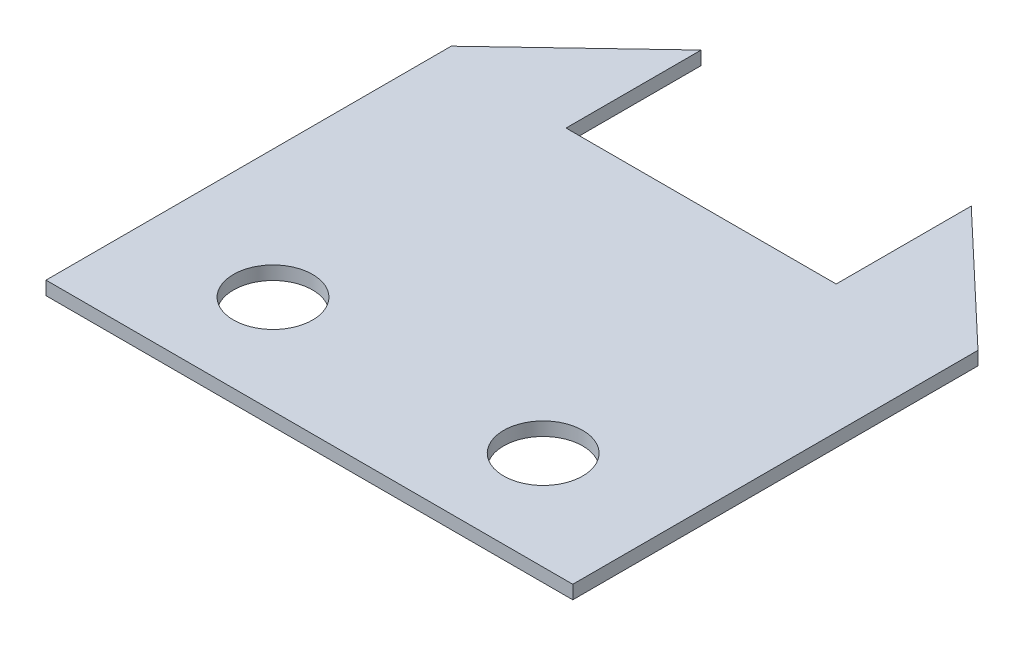
ISO-10303-21;
HEADER;
FILE_DESCRIPTION(('STEP AP214'),'2;1');
FILE_NAME('part.step','',(''),(''),'','','');
FILE_SCHEMA(('AUTOMOTIVE_DESIGN { 1 0 10303 214 1 1 1 1 }'));
ENDSEC;
DATA;
#1=APPLICATION_CONTEXT('core data for automotive mechanical design processes');
#2=APPLICATION_PROTOCOL_DEFINITION('international standard','automotive_design',2000,#1);
#3=PRODUCT_CONTEXT('',#1,'mechanical');
#4=PRODUCT('Part','Part','',(#3));
#5=PRODUCT_RELATED_PRODUCT_CATEGORY('part','',(#4));
#6=PRODUCT_DEFINITION_FORMATION('','',#4);
#7=PRODUCT_DEFINITION_CONTEXT('part definition',#1,'design');
#8=PRODUCT_DEFINITION('design','',#6,#7);
#9=PRODUCT_DEFINITION_SHAPE('','',#8);
#10=(LENGTH_UNIT() NAMED_UNIT(*) SI_UNIT(.MILLI.,.METRE.));
#11=(NAMED_UNIT(*) PLANE_ANGLE_UNIT() SI_UNIT($,.RADIAN.));
#12=(NAMED_UNIT(*) SI_UNIT($,.STERADIAN.) SOLID_ANGLE_UNIT());
#13=UNCERTAINTY_MEASURE_WITH_UNIT(LENGTH_MEASURE(1.E-05),#10,'distance_accuracy_value','');
#14=(GEOMETRIC_REPRESENTATION_CONTEXT(3) GLOBAL_UNCERTAINTY_ASSIGNED_CONTEXT((#13)) GLOBAL_UNIT_ASSIGNED_CONTEXT((#10,
#11,#12)) REPRESENTATION_CONTEXT('',''));
#15=CARTESIAN_POINT('',(0.,0.,0.));
#16=DIRECTION('',(0.,0.,1.));
#17=DIRECTION('',(1.,0.,0.));
#18=AXIS2_PLACEMENT_3D('',#15,#16,#17);
#19=CARTESIAN_POINT('',(0.,2.,0.));
#20=DIRECTION('',(0.,-1.,0.));
#21=DIRECTION('',(0.,0.,-1.));
#22=AXIS2_PLACEMENT_3D('',#19,#20,#21);
#23=PLANE('',#22);
#24=DIRECTION('',(-0.725952683905827,0.,-0.687744647910783));
#25=VECTOR('',#24,1.);
#26=CARTESIAN_POINT('',(20.,2.,-48.));
#27=LINE('',#26,#25);
#28=CARTESIAN_POINT('',(39.,2.,-30.));
#29=VERTEX_POINT('',#28);
#30=CARTESIAN_POINT('',(20.,2.,-48.));
#31=VERTEX_POINT('',#30);
#32=EDGE_CURVE('E164',#29,#31,#27,.T.);
#33=ORIENTED_EDGE('',*,*,#32,.T.);
#34=DIRECTION('',(0.,0.,1.));
#35=VECTOR('',#34,1.);
#36=CARTESIAN_POINT('',(20.,2.,-48.));
#37=LINE('',#36,#35);
#38=CARTESIAN_POINT('',(20.,2.,-28.));
#39=VERTEX_POINT('',#38);
#40=EDGE_CURVE('E100',#31,#39,#37,.T.);
#41=ORIENTED_EDGE('',*,*,#40,.T.);
#42=DIRECTION('',(-1.,0.,0.));
#43=VECTOR('',#42,1.);
#44=CARTESIAN_POINT('',(-20.,2.,-28.));
#45=LINE('',#44,#43);
#46=CARTESIAN_POINT('',(-20.,2.,-28.));
#47=VERTEX_POINT('',#46);
#48=EDGE_CURVE('E185',#39,#47,#45,.T.);
#49=ORIENTED_EDGE('',*,*,#48,.T.);
#50=DIRECTION('',(0.,0.,-1.));
#51=VECTOR('',#50,1.);
#52=CARTESIAN_POINT('',(-20.,2.,-48.));
#53=LINE('',#52,#51);
#54=CARTESIAN_POINT('',(-20.,2.,-48.));
#55=VERTEX_POINT('',#54);
#56=EDGE_CURVE('E199',#47,#55,#53,.T.);
#57=ORIENTED_EDGE('',*,*,#56,.T.);
#58=DIRECTION('',(-0.725952683905827,0.,0.687744647910783));
#59=VECTOR('',#58,1.);
#60=CARTESIAN_POINT('',(-20.,2.,-48.));
#61=LINE('',#60,#59);
#62=CARTESIAN_POINT('',(-39.,2.,-30.));
#63=VERTEX_POINT('',#62);
#64=EDGE_CURVE('E119',#55,#63,#61,.T.);
#65=ORIENTED_EDGE('',*,*,#64,.T.);
#66=DIRECTION('',(0.,0.,1.));
#67=VECTOR('',#66,1.);
#68=CARTESIAN_POINT('',(-39.,2.,30.));
#69=LINE('',#68,#67);
#70=CARTESIAN_POINT('',(-39.,2.,30.));
#71=VERTEX_POINT('',#70);
#72=EDGE_CURVE('E113',#63,#71,#69,.T.);
#73=ORIENTED_EDGE('',*,*,#72,.T.);
#74=DIRECTION('',(1.,0.,0.));
#75=VECTOR('',#74,1.);
#76=CARTESIAN_POINT('',(-39.,2.,30.));
#77=LINE('',#76,#75);
#78=CARTESIAN_POINT('',(39.,2.,30.));
#79=VERTEX_POINT('',#78);
#80=EDGE_CURVE('E117',#71,#79,#77,.T.);
#81=ORIENTED_EDGE('',*,*,#80,.T.);
#82=DIRECTION('',(0.,0.,-1.));
#83=VECTOR('',#82,1.);
#84=CARTESIAN_POINT('',(39.,2.,30.));
#85=LINE('',#84,#83);
#86=EDGE_CURVE('E57',#79,#29,#85,.T.);
#87=ORIENTED_EDGE('',*,*,#86,.T.);
#88=EDGE_LOOP('',(#33,#41,#49,#57,#65,#73,#81,#87));
#89=FACE_BOUND('',#88,.T.);
#90=CARTESIAN_POINT('',(-20.,2.,15.3846153846154));
#91=DIRECTION('',(0.,1.,0.));
#92=DIRECTION('',(0.,0.,1.));
#93=AXIS2_PLACEMENT_3D('',#90,#91,#92);
#94=CIRCLE('',#93,5.85702381253961);
#95=CARTESIAN_POINT('',(-20.,2.,21.241639197155));
#96=VERTEX_POINT('',#95);
#97=EDGE_CURVE('E146',#96,#96,#94,.T.);
#98=ORIENTED_EDGE('',*,*,#97,.F.);
#99=EDGE_LOOP('',(#98));
#100=FACE_BOUND('',#99,.T.);
#101=CARTESIAN_POINT('',(20.,2.,15.3846153846154));
#102=DIRECTION('',(0.,1.,0.));
#103=DIRECTION('',(0.,0.,-1.));
#104=AXIS2_PLACEMENT_3D('',#101,#102,#103);
#105=CIRCLE('',#104,5.85702381253961);
#106=CARTESIAN_POINT('',(20.,2.,9.52759157207579));
#107=VERTEX_POINT('',#106);
#108=EDGE_CURVE('E213',#107,#107,#105,.T.);
#109=ORIENTED_EDGE('',*,*,#108,.F.);
#110=EDGE_LOOP('',(#109));
#111=FACE_BOUND('',#110,.T.);
#112=ADVANCED_FACE('F39',(#89,#100,#111),#23,.F.);
#113=CARTESIAN_POINT('',(0.,0.,0.));
#114=DIRECTION('',(0.,-1.,0.));
#115=DIRECTION('',(0.,0.,-1.));
#116=AXIS2_PLACEMENT_3D('',#113,#114,#115);
#117=PLANE('',#116);
#118=CARTESIAN_POINT('',(-20.,0.,15.3846153846154));
#119=DIRECTION('',(0.,1.,0.));
#120=DIRECTION('',(0.,0.,1.));
#121=AXIS2_PLACEMENT_3D('',#118,#119,#120);
#122=CIRCLE('',#121,5.85702381253961);
#123=CARTESIAN_POINT('',(-20.,0.,21.241639197155));
#124=VERTEX_POINT('',#123);
#125=EDGE_CURVE('E209',#124,#124,#122,.T.);
#126=ORIENTED_EDGE('',*,*,#125,.T.);
#127=EDGE_LOOP('',(#126));
#128=FACE_BOUND('',#127,.T.);
#129=DIRECTION('',(-0.725952683905827,0.,-0.687744647910783));
#130=VECTOR('',#129,1.);
#131=CARTESIAN_POINT('',(20.,0.,-48.));
#132=LINE('',#131,#130);
#133=CARTESIAN_POINT('',(39.,0.,-30.));
#134=VERTEX_POINT('',#133);
#135=CARTESIAN_POINT('',(20.,0.,-48.));
#136=VERTEX_POINT('',#135);
#137=EDGE_CURVE('E141',#134,#136,#132,.T.);
#138=ORIENTED_EDGE('',*,*,#137,.F.);
#139=DIRECTION('',(0.,0.,-1.));
#140=VECTOR('',#139,1.);
#141=CARTESIAN_POINT('',(39.,0.,30.));
#142=LINE('',#141,#140);
#143=CARTESIAN_POINT('',(39.,0.,30.));
#144=VERTEX_POINT('',#143);
#145=EDGE_CURVE('E92',#144,#134,#142,.T.);
#146=ORIENTED_EDGE('',*,*,#145,.F.);
#147=DIRECTION('',(1.,0.,0.));
#148=VECTOR('',#147,1.);
#149=CARTESIAN_POINT('',(-39.,0.,30.));
#150=LINE('',#149,#148);
#151=CARTESIAN_POINT('',(-39.,0.,30.));
#152=VERTEX_POINT('',#151);
#153=EDGE_CURVE('E86',#152,#144,#150,.T.);
#154=ORIENTED_EDGE('',*,*,#153,.F.);
#155=DIRECTION('',(0.,0.,1.));
#156=VECTOR('',#155,1.);
#157=CARTESIAN_POINT('',(-39.,0.,30.));
#158=LINE('',#157,#156);
#159=CARTESIAN_POINT('',(-39.,0.,-30.));
#160=VERTEX_POINT('',#159);
#161=EDGE_CURVE('E128',#160,#152,#158,.T.);
#162=ORIENTED_EDGE('',*,*,#161,.F.);
#163=DIRECTION('',(-0.725952683905827,0.,0.687744647910783));
#164=VECTOR('',#163,1.);
#165=CARTESIAN_POINT('',(-20.,0.,-48.));
#166=LINE('',#165,#164);
#167=CARTESIAN_POINT('',(-20.,0.,-48.));
#168=VERTEX_POINT('',#167);
#169=EDGE_CURVE('E155',#168,#160,#166,.T.);
#170=ORIENTED_EDGE('',*,*,#169,.F.);
#171=DIRECTION('',(0.,0.,-1.));
#172=VECTOR('',#171,1.);
#173=CARTESIAN_POINT('',(-20.,0.,-48.));
#174=LINE('',#173,#172);
#175=CARTESIAN_POINT('',(-20.,0.,-28.));
#176=VERTEX_POINT('',#175);
#177=EDGE_CURVE('E152',#176,#168,#174,.T.);
#178=ORIENTED_EDGE('',*,*,#177,.F.);
#179=DIRECTION('',(-1.,0.,0.));
#180=VECTOR('',#179,1.);
#181=CARTESIAN_POINT('',(-20.,0.,-28.));
#182=LINE('',#181,#180);
#183=CARTESIAN_POINT('',(20.,0.,-28.));
#184=VERTEX_POINT('',#183);
#185=EDGE_CURVE('E149',#184,#176,#182,.T.);
#186=ORIENTED_EDGE('',*,*,#185,.F.);
#187=DIRECTION('',(0.,0.,1.));
#188=VECTOR('',#187,1.);
#189=CARTESIAN_POINT('',(20.,0.,-48.));
#190=LINE('',#189,#188);
#191=EDGE_CURVE('E145',#136,#184,#190,.T.);
#192=ORIENTED_EDGE('',*,*,#191,.F.);
#193=EDGE_LOOP('',(#138,#146,#154,#162,#170,#178,#186,#192));
#194=FACE_BOUND('',#193,.T.);
#195=CARTESIAN_POINT('',(20.,0.,15.3846153846154));
#196=DIRECTION('',(0.,1.,0.));
#197=DIRECTION('',(0.,0.,-1.));
#198=AXIS2_PLACEMENT_3D('',#195,#196,#197);
#199=CIRCLE('',#198,5.85702381253961);
#200=CARTESIAN_POINT('',(20.,0.,9.52759157207579));
#201=VERTEX_POINT('',#200);
#202=EDGE_CURVE('E217',#201,#201,#199,.T.);
#203=ORIENTED_EDGE('',*,*,#202,.T.);
#204=EDGE_LOOP('',(#203));
#205=FACE_BOUND('',#204,.T.);
#206=ADVANCED_FACE('F189',(#128,#194,#205),#117,.T.);
#207=CARTESIAN_POINT('',(20.,2.,-48.));
#208=DIRECTION('',(-0.687744647910783,0.,0.725952683905827));
#209=DIRECTION('',(0.725952683905827,0.,0.687744647910783));
#210=AXIS2_PLACEMENT_3D('',#207,#208,#209);
#211=PLANE('',#210);
#212=ORIENTED_EDGE('',*,*,#137,.T.);
#213=DIRECTION('',(0.,-1.,0.));
#214=VECTOR('',#213,1.);
#215=CARTESIAN_POINT('',(20.,2.,-48.));
#216=LINE('',#215,#214);
#217=EDGE_CURVE('E11',#31,#136,#216,.T.);
#218=ORIENTED_EDGE('',*,*,#217,.F.);
#219=ORIENTED_EDGE('',*,*,#32,.F.);
#220=DIRECTION('',(0.,-1.,0.));
#221=VECTOR('',#220,1.);
#222=CARTESIAN_POINT('',(39.,2.,-30.));
#223=LINE('',#222,#221);
#224=EDGE_CURVE('E137',#29,#134,#223,.T.);
#225=ORIENTED_EDGE('',*,*,#224,.T.);
#226=EDGE_LOOP('',(#212,#218,#219,#225));
#227=FACE_BOUND('',#226,.T.);
#228=ADVANCED_FACE('F41',(#227),#211,.F.);
#229=CARTESIAN_POINT('',(20.,2.,-48.));
#230=DIRECTION('',(1.,0.,0.));
#231=DIRECTION('',(0.,0.,-1.));
#232=AXIS2_PLACEMENT_3D('',#229,#230,#231);
#233=PLANE('',#232);
#234=ORIENTED_EDGE('',*,*,#191,.T.);
#235=DIRECTION('',(0.,-1.,0.));
#236=VECTOR('',#235,1.);
#237=CARTESIAN_POINT('',(20.,2.,-28.));
#238=LINE('',#237,#236);
#239=EDGE_CURVE('E49',#39,#184,#238,.T.);
#240=ORIENTED_EDGE('',*,*,#239,.F.);
#241=ORIENTED_EDGE('',*,*,#40,.F.);
#242=ORIENTED_EDGE('',*,*,#217,.T.);
#243=EDGE_LOOP('',(#234,#240,#241,#242));
#244=FACE_BOUND('',#243,.T.);
#245=ADVANCED_FACE('F251',(#244),#233,.F.);
#246=CARTESIAN_POINT('',(-20.,2.,-28.));
#247=DIRECTION('',(0.,0.,1.));
#248=DIRECTION('',(1.,0.,0.));
#249=AXIS2_PLACEMENT_3D('',#246,#247,#248);
#250=PLANE('',#249);
#251=ORIENTED_EDGE('',*,*,#185,.T.);
#252=DIRECTION('',(0.,-1.,0.));
#253=VECTOR('',#252,1.);
#254=CARTESIAN_POINT('',(-20.,2.,-28.));
#255=LINE('',#254,#253);
#256=EDGE_CURVE('E175',#47,#176,#255,.T.);
#257=ORIENTED_EDGE('',*,*,#256,.F.);
#258=ORIENTED_EDGE('',*,*,#48,.F.);
#259=ORIENTED_EDGE('',*,*,#239,.T.);
#260=EDGE_LOOP('',(#251,#257,#258,#259));
#261=FACE_BOUND('',#260,.T.);
#262=ADVANCED_FACE('F183',(#261),#250,.F.);
#263=CARTESIAN_POINT('',(-20.,2.,-48.));
#264=DIRECTION('',(-1.,0.,0.));
#265=DIRECTION('',(0.,0.,1.));
#266=AXIS2_PLACEMENT_3D('',#263,#264,#265);
#267=PLANE('',#266);
#268=ORIENTED_EDGE('',*,*,#177,.T.);
#269=DIRECTION('',(0.,-1.,0.));
#270=VECTOR('',#269,1.);
#271=CARTESIAN_POINT('',(-20.,2.,-48.));
#272=LINE('',#271,#270);
#273=EDGE_CURVE('E171',#55,#168,#272,.T.);
#274=ORIENTED_EDGE('',*,*,#273,.F.);
#275=ORIENTED_EDGE('',*,*,#56,.F.);
#276=ORIENTED_EDGE('',*,*,#256,.T.);
#277=EDGE_LOOP('',(#268,#274,#275,#276));
#278=FACE_BOUND('',#277,.T.);
#279=ADVANCED_FACE('F194',(#278),#267,.F.);
#280=CARTESIAN_POINT('',(-20.,2.,-48.));
#281=DIRECTION('',(0.687744647910783,0.,0.725952683905827));
#282=DIRECTION('',(0.725952683905827,0.,-0.687744647910783));
#283=AXIS2_PLACEMENT_3D('',#280,#281,#282);
#284=PLANE('',#283);
#285=ORIENTED_EDGE('',*,*,#169,.T.);
#286=DIRECTION('',(0.,-1.,0.));
#287=VECTOR('',#286,1.);
#288=CARTESIAN_POINT('',(-39.,2.,-30.));
#289=LINE('',#288,#287);
#290=EDGE_CURVE('E130',#63,#160,#289,.T.);
#291=ORIENTED_EDGE('',*,*,#290,.F.);
#292=ORIENTED_EDGE('',*,*,#64,.F.);
#293=ORIENTED_EDGE('',*,*,#273,.T.);
#294=EDGE_LOOP('',(#285,#291,#292,#293));
#295=FACE_BOUND('',#294,.T.);
#296=ADVANCED_FACE('F197',(#295),#284,.F.);
#297=CARTESIAN_POINT('',(-39.,2.,30.));
#298=DIRECTION('',(1.,0.,0.));
#299=DIRECTION('',(0.,0.,-1.));
#300=AXIS2_PLACEMENT_3D('',#297,#298,#299);
#301=PLANE('',#300);
#302=ORIENTED_EDGE('',*,*,#161,.T.);
#303=DIRECTION('',(0.,-1.,0.));
#304=VECTOR('',#303,1.);
#305=CARTESIAN_POINT('',(-39.,2.,30.));
#306=LINE('',#305,#304);
#307=EDGE_CURVE('E125',#71,#152,#306,.T.);
#308=ORIENTED_EDGE('',*,*,#307,.F.);
#309=ORIENTED_EDGE('',*,*,#72,.F.);
#310=ORIENTED_EDGE('',*,*,#290,.T.);
#311=EDGE_LOOP('',(#302,#308,#309,#310));
#312=FACE_BOUND('',#311,.T.);
#313=ADVANCED_FACE('F126',(#312),#301,.F.);
#314=CARTESIAN_POINT('',(-39.,2.,30.));
#315=DIRECTION('',(0.,0.,-1.));
#316=DIRECTION('',(-1.,0.,0.));
#317=AXIS2_PLACEMENT_3D('',#314,#315,#316);
#318=PLANE('',#317);
#319=ORIENTED_EDGE('',*,*,#153,.T.);
#320=DIRECTION('',(0.,-1.,0.));
#321=VECTOR('',#320,1.);
#322=CARTESIAN_POINT('',(39.,2.,30.));
#323=LINE('',#322,#321);
#324=EDGE_CURVE('E131',#79,#144,#323,.T.);
#325=ORIENTED_EDGE('',*,*,#324,.F.);
#326=ORIENTED_EDGE('',*,*,#80,.F.);
#327=ORIENTED_EDGE('',*,*,#307,.T.);
#328=EDGE_LOOP('',(#319,#325,#326,#327));
#329=FACE_BOUND('',#328,.T.);
#330=ADVANCED_FACE('F133',(#329),#318,.F.);
#331=CARTESIAN_POINT('',(39.,2.,30.));
#332=DIRECTION('',(-1.,0.,0.));
#333=DIRECTION('',(0.,0.,1.));
#334=AXIS2_PLACEMENT_3D('',#331,#332,#333);
#335=PLANE('',#334);
#336=ORIENTED_EDGE('',*,*,#145,.T.);
#337=ORIENTED_EDGE('',*,*,#224,.F.);
#338=ORIENTED_EDGE('',*,*,#86,.F.);
#339=ORIENTED_EDGE('',*,*,#324,.T.);
#340=EDGE_LOOP('',(#336,#337,#338,#339));
#341=FACE_BOUND('',#340,.T.);
#342=ADVANCED_FACE('F239',(#341),#335,.F.);
#343=CARTESIAN_POINT('',(-20.,2.,15.3846153846154));
#344=DIRECTION('',(0.,-1.,0.));
#345=DIRECTION('',(0.,0.,-1.));
#346=AXIS2_PLACEMENT_3D('',#343,#344,#345);
#347=CYLINDRICAL_SURFACE('',#346,5.85702381253961);
#348=ORIENTED_EDGE('',*,*,#97,.T.);
#349=EDGE_LOOP('',(#348));
#350=FACE_BOUND('',#349,.T.);
#351=ORIENTED_EDGE('',*,*,#125,.F.);
#352=EDGE_LOOP('',(#351));
#353=FACE_BOUND('',#352,.T.);
#354=ADVANCED_FACE('F236',(#350,#353),#347,.F.);
#355=CARTESIAN_POINT('',(20.,2.,15.3846153846154));
#356=DIRECTION('',(0.,-1.,0.));
#357=DIRECTION('',(0.,0.,-1.));
#358=AXIS2_PLACEMENT_3D('',#355,#356,#357);
#359=CYLINDRICAL_SURFACE('',#358,5.85702381253961);
#360=ORIENTED_EDGE('',*,*,#108,.T.);
#361=EDGE_LOOP('',(#360));
#362=FACE_BOUND('',#361,.T.);
#363=ORIENTED_EDGE('',*,*,#202,.F.);
#364=EDGE_LOOP('',(#363));
#365=FACE_BOUND('',#364,.T.);
#366=ADVANCED_FACE('F225',(#362,#365),#359,.F.);
#367=CLOSED_SHELL('',(#112,#206,#228,#245,#262,#279,#296,#313,#330,#342,#354,#366));
#368=MANIFOLD_SOLID_BREP('B2',#367);
#369=ADVANCED_BREP_SHAPE_REPRESENTATION('',(#18,#368),#14);
#370=SHAPE_DEFINITION_REPRESENTATION(#9,#369);
ENDSEC;
END-ISO-10303-21;
